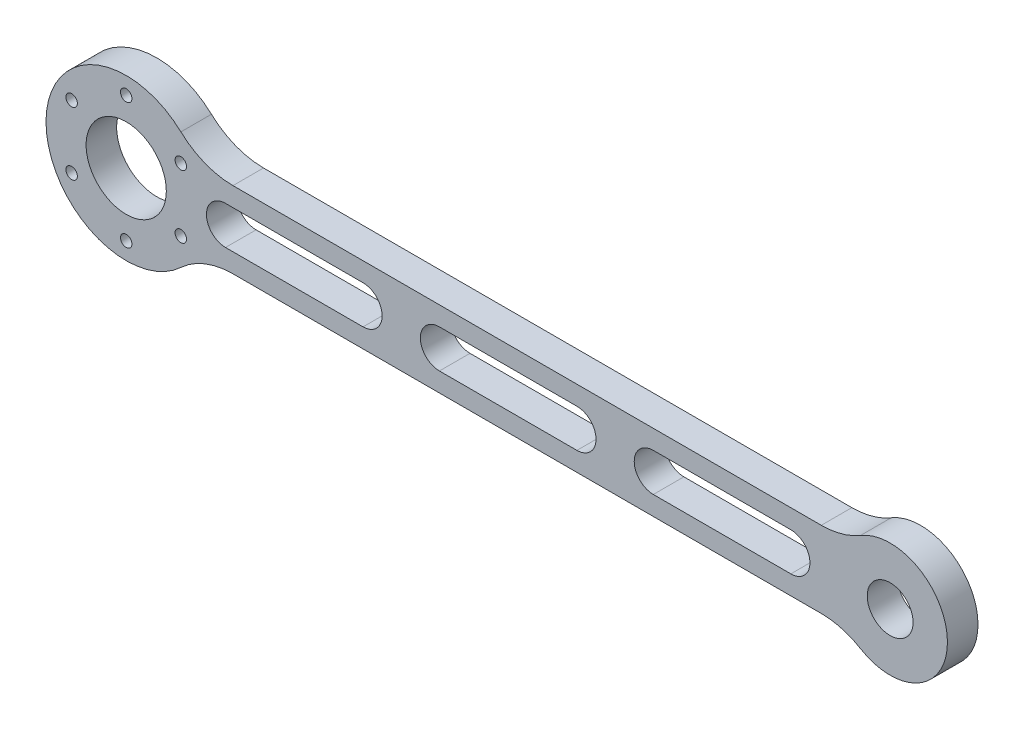
ISO-10303-21;
HEADER;
FILE_DESCRIPTION(('STEP AP214'),'2;1');
FILE_NAME('part.step','',(''),(''),'','','');
FILE_SCHEMA(('AUTOMOTIVE_DESIGN { 1 0 10303 214 1 1 1 1 }'));
ENDSEC;
DATA;
#1=APPLICATION_CONTEXT('core data for automotive mechanical design processes');
#2=APPLICATION_PROTOCOL_DEFINITION('international standard','automotive_design',2000,#1);
#3=PRODUCT_CONTEXT('',#1,'mechanical');
#4=PRODUCT('Part','Part','',(#3));
#5=PRODUCT_RELATED_PRODUCT_CATEGORY('part','',(#4));
#6=PRODUCT_DEFINITION_FORMATION('','',#4);
#7=PRODUCT_DEFINITION_CONTEXT('part definition',#1,'design');
#8=PRODUCT_DEFINITION('design','',#6,#7);
#9=PRODUCT_DEFINITION_SHAPE('','',#8);
#10=(LENGTH_UNIT() NAMED_UNIT(*) SI_UNIT(.MILLI.,.METRE.));
#11=(NAMED_UNIT(*) PLANE_ANGLE_UNIT() SI_UNIT($,.RADIAN.));
#12=(NAMED_UNIT(*) SI_UNIT($,.STERADIAN.) SOLID_ANGLE_UNIT());
#13=UNCERTAINTY_MEASURE_WITH_UNIT(LENGTH_MEASURE(1.E-05),#10,'distance_accuracy_value','');
#14=(GEOMETRIC_REPRESENTATION_CONTEXT(3) GLOBAL_UNCERTAINTY_ASSIGNED_CONTEXT((#13)) GLOBAL_UNIT_ASSIGNED_CONTEXT((#10,
#11,#12)) REPRESENTATION_CONTEXT('',''));
#15=CARTESIAN_POINT('',(0.,0.,0.));
#16=DIRECTION('',(0.,0.,1.));
#17=DIRECTION('',(1.,0.,0.));
#18=AXIS2_PLACEMENT_3D('',#15,#16,#17);
#19=CARTESIAN_POINT('',(0.,-10.,8.));
#20=DIRECTION('',(0.,1.,0.));
#21=DIRECTION('',(0.,0.,1.));
#22=AXIS2_PLACEMENT_3D('',#19,#20,#21);
#23=PLANE('',#22);
#24=DIRECTION('',(1.,0.,0.));
#25=VECTOR('',#24,1.);
#26=CARTESIAN_POINT('',(0.,-10.,8.));
#27=LINE('',#26,#25);
#28=CARTESIAN_POINT('',(27.9463772249642,-10.,8.));
#29=VERTEX_POINT('',#28);
#30=CARTESIAN_POINT('',(181.97224362268,-10.,8.));
#31=VERTEX_POINT('',#30);
#32=EDGE_CURVE('E254',#29,#31,#27,.T.);
#33=ORIENTED_EDGE('',*,*,#32,.F.);
#34=DIRECTION('',(0.,0.,-1.));
#35=VECTOR('',#34,1.);
#36=CARTESIAN_POINT('',(27.9463772249642,-10.,8.));
#37=LINE('',#36,#35);
#38=CARTESIAN_POINT('',(27.9463772249642,-10.,0.));
#39=VERTEX_POINT('',#38);
#40=EDGE_CURVE('E325',#29,#39,#37,.T.);
#41=ORIENTED_EDGE('',*,*,#40,.T.);
#42=DIRECTION('',(1.,0.,0.));
#43=VECTOR('',#42,1.);
#44=CARTESIAN_POINT('',(0.,-10.,0.));
#45=LINE('',#44,#43);
#46=CARTESIAN_POINT('',(181.97224362268,-10.,0.));
#47=VERTEX_POINT('',#46);
#48=EDGE_CURVE('E263',#39,#47,#45,.T.);
#49=ORIENTED_EDGE('',*,*,#48,.T.);
#50=DIRECTION('',(0.,0.,1.));
#51=VECTOR('',#50,1.);
#52=CARTESIAN_POINT('',(181.97224362268,-10.,8.));
#53=LINE('',#52,#51);
#54=EDGE_CURVE('E277',#47,#31,#53,.T.);
#55=ORIENTED_EDGE('',*,*,#54,.T.);
#56=EDGE_LOOP('',(#33,#41,#49,#55));
#57=FACE_BOUND('',#56,.T.);
#58=ADVANCED_FACE('F36',(#57),#23,.F.);
#59=CARTESIAN_POINT('',(200.,0.,8.));
#60=DIRECTION('',(0.,0.,-1.));
#61=DIRECTION('',(-1.,0.,0.));
#62=AXIS2_PLACEMENT_3D('',#59,#60,#61);
#63=CYLINDRICAL_SURFACE('',#62,15.);
#64=CARTESIAN_POINT('',(200.,0.,0.));
#65=DIRECTION('',(0.,0.,1.));
#66=DIRECTION('',(1.,0.,0.));
#67=AXIS2_PLACEMENT_3D('',#64,#65,#66);
#68=CIRCLE('',#67,15.);
#69=CARTESIAN_POINT('',(192.273818695434,-12.8571428571429,0.));
#70=VERTEX_POINT('',#69);
#71=CARTESIAN_POINT('',(192.273818695434,12.8571428571429,0.));
#72=VERTEX_POINT('',#71);
#73=EDGE_CURVE('E265',#70,#72,#68,.T.);
#74=ORIENTED_EDGE('',*,*,#73,.T.);
#75=DIRECTION('',(0.,0.,-1.));
#76=VECTOR('',#75,1.);
#77=CARTESIAN_POINT('',(192.273818695434,12.8571428571429,8.));
#78=LINE('',#77,#76);
#79=CARTESIAN_POINT('',(192.273818695434,12.8571428571429,8.));
#80=VERTEX_POINT('',#79);
#81=EDGE_CURVE('E275',#72,#80,#78,.F.);
#82=ORIENTED_EDGE('',*,*,#81,.T.);
#83=CARTESIAN_POINT('',(200.,0.,8.));
#84=DIRECTION('',(0.,0.,1.));
#85=DIRECTION('',(1.,0.,0.));
#86=AXIS2_PLACEMENT_3D('',#83,#84,#85);
#87=CIRCLE('',#86,15.);
#88=CARTESIAN_POINT('',(192.273818695434,-12.8571428571429,8.));
#89=VERTEX_POINT('',#88);
#90=EDGE_CURVE('E256',#89,#80,#87,.T.);
#91=ORIENTED_EDGE('',*,*,#90,.F.);
#92=DIRECTION('',(0.,0.,-1.));
#93=VECTOR('',#92,1.);
#94=CARTESIAN_POINT('',(192.273818695434,-12.8571428571429,8.));
#95=LINE('',#94,#93);
#96=EDGE_CURVE('E272',#89,#70,#95,.T.);
#97=ORIENTED_EDGE('',*,*,#96,.T.);
#98=EDGE_LOOP('',(#74,#82,#91,#97));
#99=FACE_BOUND('',#98,.T.);
#100=ADVANCED_FACE('F399',(#99),#63,.T.);
#101=CARTESIAN_POINT('',(0.,10.,8.));
#102=DIRECTION('',(0.,1.,0.));
#103=DIRECTION('',(0.,0.,1.));
#104=AXIS2_PLACEMENT_3D('',#101,#102,#103);
#105=PLANE('',#104);
#106=DIRECTION('',(1.,0.,0.));
#107=VECTOR('',#106,1.);
#108=CARTESIAN_POINT('',(0.,10.,0.));
#109=LINE('',#108,#107);
#110=CARTESIAN_POINT('',(27.9463772249642,10.,0.));
#111=VERTEX_POINT('',#110);
#112=CARTESIAN_POINT('',(181.97224362268,10.,0.));
#113=VERTEX_POINT('',#112);
#114=EDGE_CURVE('E257',#111,#113,#109,.T.);
#115=ORIENTED_EDGE('',*,*,#114,.F.);
#116=DIRECTION('',(0.,0.,1.));
#117=VECTOR('',#116,1.);
#118=CARTESIAN_POINT('',(27.9463772249642,10.,8.));
#119=LINE('',#118,#117);
#120=CARTESIAN_POINT('',(27.9463772249642,10.,8.));
#121=VERTEX_POINT('',#120);
#122=EDGE_CURVE('E57',#111,#121,#119,.T.);
#123=ORIENTED_EDGE('',*,*,#122,.T.);
#124=DIRECTION('',(1.,0.,0.));
#125=VECTOR('',#124,1.);
#126=CARTESIAN_POINT('',(0.,10.,8.));
#127=LINE('',#126,#125);
#128=CARTESIAN_POINT('',(181.97224362268,10.,8.));
#129=VERTEX_POINT('',#128);
#130=EDGE_CURVE('E260',#121,#129,#127,.T.);
#131=ORIENTED_EDGE('',*,*,#130,.T.);
#132=DIRECTION('',(0.,0.,-1.));
#133=VECTOR('',#132,1.);
#134=CARTESIAN_POINT('',(181.97224362268,10.,8.));
#135=LINE('',#134,#133);
#136=EDGE_CURVE('E262',#129,#113,#135,.T.);
#137=ORIENTED_EDGE('',*,*,#136,.T.);
#138=EDGE_LOOP('',(#115,#123,#131,#137));
#139=FACE_BOUND('',#138,.T.);
#140=ADVANCED_FACE('F404',(#139),#105,.T.);
#141=CARTESIAN_POINT('',(0.,0.,8.));
#142=DIRECTION('',(0.,0.,1.));
#143=DIRECTION('',(1.,0.,0.));
#144=AXIS2_PLACEMENT_3D('',#141,#142,#143);
#145=PLANE('',#144);
#146=CARTESIAN_POINT('',(0.,16.5,8.));
#147=DIRECTION('',(0.,0.,-1.));
#148=DIRECTION('',(-1.,0.,0.));
#149=AXIS2_PLACEMENT_3D('',#146,#147,#148);
#150=CIRCLE('',#149,1.5);
#151=CARTESIAN_POINT('',(-1.5,16.5,8.));
#152=VERTEX_POINT('',#151);
#153=EDGE_CURVE('E357',#152,#152,#150,.T.);
#154=ORIENTED_EDGE('',*,*,#153,.T.);
#155=EDGE_LOOP('',(#154));
#156=FACE_BOUND('',#155,.T.);
#157=CARTESIAN_POINT('',(14.2894191624429,8.24999999999938,8.));
#158=DIRECTION('',(0.,0.,-1.));
#159=DIRECTION('',(-1.,0.,0.));
#160=AXIS2_PLACEMENT_3D('',#157,#158,#159);
#161=CIRCLE('',#160,1.50000000000071);
#162=CARTESIAN_POINT('',(12.7894191624422,8.24999999999938,8.));
#163=VERTEX_POINT('',#162);
#164=EDGE_CURVE('E489',#163,#163,#161,.T.);
#165=ORIENTED_EDGE('',*,*,#164,.T.);
#166=EDGE_LOOP('',(#165));
#167=FACE_BOUND('',#166,.T.);
#168=CARTESIAN_POINT('',(14.2894191624422,-8.25000000000061,8.));
#169=DIRECTION('',(0.,0.,-1.));
#170=DIRECTION('',(-1.,0.,0.));
#171=AXIS2_PLACEMENT_3D('',#168,#169,#170);
#172=CIRCLE('',#171,1.50000000000134);
#173=CARTESIAN_POINT('',(12.7894191624408,-8.25000000000061,8.));
#174=VERTEX_POINT('',#173);
#175=EDGE_CURVE('E493',#174,#174,#172,.T.);
#176=ORIENTED_EDGE('',*,*,#175,.T.);
#177=EDGE_LOOP('',(#176));
#178=FACE_BOUND('',#177,.T.);
#179=CARTESIAN_POINT('',(-1.40283328236781E-12,-16.5,8.));
#180=DIRECTION('',(0.,0.,-1.));
#181=DIRECTION('',(-1.,0.,0.));
#182=AXIS2_PLACEMENT_3D('',#179,#180,#181);
#183=CIRCLE('',#182,1.50000000000145);
#184=CARTESIAN_POINT('',(-1.50000000000286,-16.5,8.));
#185=VERTEX_POINT('',#184);
#186=EDGE_CURVE('E497',#185,#185,#183,.T.);
#187=ORIENTED_EDGE('',*,*,#186,.T.);
#188=EDGE_LOOP('',(#187));
#189=FACE_BOUND('',#188,.T.);
#190=CARTESIAN_POINT('',(-14.2894191624443,-8.24999999999939,8.));
#191=DIRECTION('',(0.,0.,-1.));
#192=DIRECTION('',(-1.,0.,0.));
#193=AXIS2_PLACEMENT_3D('',#190,#191,#192);
#194=CIRCLE('',#193,1.50000000000091);
#195=CARTESIAN_POINT('',(-15.7894191624452,-8.24999999999939,8.));
#196=VERTEX_POINT('',#195);
#197=EDGE_CURVE('E501',#196,#196,#194,.T.);
#198=ORIENTED_EDGE('',*,*,#197,.T.);
#199=EDGE_LOOP('',(#198));
#200=FACE_BOUND('',#199,.T.);
#201=CARTESIAN_POINT('',(-14.2894191624436,8.25000000000061,8.));
#202=DIRECTION('',(0.,0.,-1.));
#203=DIRECTION('',(-1.,0.,0.));
#204=AXIS2_PLACEMENT_3D('',#201,#202,#203);
#205=CIRCLE('',#204,1.5000000000002);
#206=CARTESIAN_POINT('',(-15.7894191624438,8.25000000000061,8.));
#207=VERTEX_POINT('',#206);
#208=EDGE_CURVE('E504',#207,#207,#205,.T.);
#209=ORIENTED_EDGE('',*,*,#208,.T.);
#210=EDGE_LOOP('',(#209));
#211=FACE_BOUND('',#210,.T.);
#212=CARTESIAN_POINT('',(0.,0.,8.));
#213=DIRECTION('',(0.,0.,-1.));
#214=DIRECTION('',(-1.,0.,0.));
#215=AXIS2_PLACEMENT_3D('',#212,#213,#214);
#216=CIRCLE('',#215,21.);
#217=CARTESIAN_POINT('',(14.3139980908353,-15.3658536585366,8.));
#218=VERTEX_POINT('',#217);
#219=CARTESIAN_POINT('',(14.3139980908353,15.3658536585366,8.));
#220=VERTEX_POINT('',#219);
#221=EDGE_CURVE('E231',#218,#220,#216,.T.);
#222=ORIENTED_EDGE('',*,*,#221,.F.);
#223=CARTESIAN_POINT('',(27.9463772249642,-30.,8.));
#224=DIRECTION('',(0.,0.,1.));
#225=DIRECTION('',(1.,0.,0.));
#226=AXIS2_PLACEMENT_3D('',#223,#224,#225);
#227=CIRCLE('',#226,20.);
#228=EDGE_CURVE('E336',#218,#29,#227,.F.);
#229=ORIENTED_EDGE('',*,*,#228,.T.);
#230=ORIENTED_EDGE('',*,*,#32,.T.);
#231=CARTESIAN_POINT('',(181.97224362268,-30.,8.));
#232=DIRECTION('',(0.,0.,1.));
#233=DIRECTION('',(1.,0.,0.));
#234=AXIS2_PLACEMENT_3D('',#231,#232,#233);
#235=CIRCLE('',#234,20.);
#236=EDGE_CURVE('E288',#31,#89,#235,.F.);
#237=ORIENTED_EDGE('',*,*,#236,.T.);
#238=ORIENTED_EDGE('',*,*,#90,.T.);
#239=CARTESIAN_POINT('',(181.97224362268,30.,8.));
#240=DIRECTION('',(0.,0.,1.));
#241=DIRECTION('',(1.,0.,0.));
#242=AXIS2_PLACEMENT_3D('',#239,#240,#241);
#243=CIRCLE('',#242,20.);
#244=EDGE_CURVE('E282',#80,#129,#243,.F.);
#245=ORIENTED_EDGE('',*,*,#244,.T.);
#246=ORIENTED_EDGE('',*,*,#130,.F.);
#247=CARTESIAN_POINT('',(27.9463772249642,30.,8.));
#248=DIRECTION('',(0.,0.,1.));
#249=DIRECTION('',(1.,0.,0.));
#250=AXIS2_PLACEMENT_3D('',#247,#248,#249);
#251=CIRCLE('',#250,20.);
#252=EDGE_CURVE('E11',#121,#220,#251,.F.);
#253=ORIENTED_EDGE('',*,*,#252,.T.);
#254=EDGE_LOOP('',(#222,#229,#230,#237,#238,#245,#246,#253));
#255=FACE_BOUND('',#254,.T.);
#256=CARTESIAN_POINT('',(138.,0.,8.));
#257=DIRECTION('',(0.,0.,1.));
#258=DIRECTION('',(1.,0.,0.));
#259=AXIS2_PLACEMENT_3D('',#256,#257,#258);
#260=CIRCLE('',#259,4.99999999999999);
#261=CARTESIAN_POINT('',(138.,5.,8.));
#262=VERTEX_POINT('',#261);
#263=CARTESIAN_POINT('',(138.,-5.00000000000002,8.));
#264=VERTEX_POINT('',#263);
#265=EDGE_CURVE('E192',#262,#264,#260,.T.);
#266=ORIENTED_EDGE('',*,*,#265,.F.);
#267=DIRECTION('',(-1.,0.,0.));
#268=VECTOR('',#267,1.);
#269=CARTESIAN_POINT('',(0.,5.00000000000004,8.));
#270=LINE('',#269,#268);
#271=CARTESIAN_POINT('',(174.,4.99999999999999,8.));
#272=VERTEX_POINT('',#271);
#273=EDGE_CURVE('E197',#272,#262,#270,.T.);
#274=ORIENTED_EDGE('',*,*,#273,.F.);
#275=CARTESIAN_POINT('',(174.,0.,8.));
#276=DIRECTION('',(0.,0.,1.));
#277=DIRECTION('',(1.,0.,0.));
#278=AXIS2_PLACEMENT_3D('',#275,#276,#277);
#279=CIRCLE('',#278,4.99999999999999);
#280=CARTESIAN_POINT('',(174.,-5.,8.));
#281=VERTEX_POINT('',#280);
#282=EDGE_CURVE('E176',#281,#272,#279,.T.);
#283=ORIENTED_EDGE('',*,*,#282,.F.);
#284=DIRECTION('',(-1.,0.,0.));
#285=VECTOR('',#284,1.);
#286=CARTESIAN_POINT('',(0.,-5.00000000000007,8.));
#287=LINE('',#286,#285);
#288=EDGE_CURVE('E187',#281,#264,#287,.T.);
#289=ORIENTED_EDGE('',*,*,#288,.T.);
#290=EDGE_LOOP('',(#266,#274,#283,#289));
#291=FACE_BOUND('',#290,.T.);
#292=CARTESIAN_POINT('',(118.,0.,8.));
#293=DIRECTION('',(0.,0.,1.));
#294=DIRECTION('',(1.,0.,0.));
#295=AXIS2_PLACEMENT_3D('',#292,#293,#294);
#296=CIRCLE('',#295,5.);
#297=CARTESIAN_POINT('',(118.,-5.,8.));
#298=VERTEX_POINT('',#297);
#299=CARTESIAN_POINT('',(118.,4.99999999999999,8.));
#300=VERTEX_POINT('',#299);
#301=EDGE_CURVE('E207',#298,#300,#296,.T.);
#302=ORIENTED_EDGE('',*,*,#301,.F.);
#303=DIRECTION('',(-1.,0.,0.));
#304=VECTOR('',#303,1.);
#305=CARTESIAN_POINT('',(0.,-5.00000000000005,8.));
#306=LINE('',#305,#304);
#307=CARTESIAN_POINT('',(82.,-5.00000000000002,8.));
#308=VERTEX_POINT('',#307);
#309=EDGE_CURVE('E216',#298,#308,#306,.T.);
#310=ORIENTED_EDGE('',*,*,#309,.T.);
#311=CARTESIAN_POINT('',(82.,0.,8.));
#312=DIRECTION('',(0.,0.,1.));
#313=DIRECTION('',(1.,0.,0.));
#314=AXIS2_PLACEMENT_3D('',#311,#312,#313);
#315=CIRCLE('',#314,5.);
#316=CARTESIAN_POINT('',(82.,5.,8.));
#317=VERTEX_POINT('',#316);
#318=EDGE_CURVE('E213',#317,#308,#315,.T.);
#319=ORIENTED_EDGE('',*,*,#318,.F.);
#320=DIRECTION('',(-1.,0.,0.));
#321=VECTOR('',#320,1.);
#322=CARTESIAN_POINT('',(0.,5.00000000000002,8.));
#323=LINE('',#322,#321);
#324=EDGE_CURVE('E209',#300,#317,#323,.T.);
#325=ORIENTED_EDGE('',*,*,#324,.F.);
#326=EDGE_LOOP('',(#302,#310,#319,#325));
#327=FACE_BOUND('',#326,.T.);
#328=CARTESIAN_POINT('',(62.,-3.97984803854338E-13,8.));
#329=DIRECTION('',(0.,0.,1.));
#330=DIRECTION('',(1.,0.,0.));
#331=AXIS2_PLACEMENT_3D('',#328,#329,#330);
#332=CIRCLE('',#331,5.00000000000001);
#333=CARTESIAN_POINT('',(62.,-5.0000000000004,8.));
#334=VERTEX_POINT('',#333);
#335=CARTESIAN_POINT('',(62.,4.9999999999996,8.));
#336=VERTEX_POINT('',#335);
#337=EDGE_CURVE('E228',#334,#336,#332,.T.);
#338=ORIENTED_EDGE('',*,*,#337,.F.);
#339=DIRECTION('',(-1.,0.,0.));
#340=VECTOR('',#339,1.);
#341=CARTESIAN_POINT('',(0.,-5.00000000000042,8.));
#342=LINE('',#341,#340);
#343=CARTESIAN_POINT('',(26.,-5.00000000000041,8.));
#344=VERTEX_POINT('',#343);
#345=EDGE_CURVE('E237',#334,#344,#342,.T.);
#346=ORIENTED_EDGE('',*,*,#345,.T.);
#347=CARTESIAN_POINT('',(26.,-4.01454250806292E-13,8.));
#348=DIRECTION('',(0.,0.,1.));
#349=DIRECTION('',(1.,0.,0.));
#350=AXIS2_PLACEMENT_3D('',#347,#348,#349);
#351=CIRCLE('',#350,5.);
#352=CARTESIAN_POINT('',(26.,4.99999999999961,8.));
#353=VERTEX_POINT('',#352);
#354=EDGE_CURVE('E234',#353,#344,#351,.T.);
#355=ORIENTED_EDGE('',*,*,#354,.F.);
#356=DIRECTION('',(-1.,0.,0.));
#357=VECTOR('',#356,1.);
#358=CARTESIAN_POINT('',(0.,4.99999999999962,8.));
#359=LINE('',#358,#357);
#360=EDGE_CURVE('E230',#336,#353,#359,.T.);
#361=ORIENTED_EDGE('',*,*,#360,.F.);
#362=EDGE_LOOP('',(#338,#346,#355,#361));
#363=FACE_BOUND('',#362,.T.);
#364=CARTESIAN_POINT('',(200.,0.,8.));
#365=DIRECTION('',(0.,0.,1.));
#366=DIRECTION('',(1.,0.,0.));
#367=AXIS2_PLACEMENT_3D('',#364,#365,#366);
#368=CIRCLE('',#367,6.00000000000002);
#369=CARTESIAN_POINT('',(206.,0.,8.));
#370=VERTEX_POINT('',#369);
#371=EDGE_CURVE('E204',#370,#370,#368,.T.);
#372=ORIENTED_EDGE('',*,*,#371,.F.);
#373=EDGE_LOOP('',(#372));
#374=FACE_BOUND('',#373,.T.);
#375=CARTESIAN_POINT('',(0.,0.,8.));
#376=DIRECTION('',(0.,0.,1.));
#377=DIRECTION('',(1.,0.,0.));
#378=AXIS2_PLACEMENT_3D('',#375,#376,#377);
#379=CIRCLE('',#378,10.5);
#380=CARTESIAN_POINT('',(10.5,0.,8.));
#381=VERTEX_POINT('',#380);
#382=EDGE_CURVE('E248',#381,#381,#379,.T.);
#383=ORIENTED_EDGE('',*,*,#382,.F.);
#384=EDGE_LOOP('',(#383));
#385=FACE_BOUND('',#384,.T.);
#386=ADVANCED_FACE('F194',(#156,#167,#178,#189,#200,#211,#255,#291,#327,#363,#374,#385),#145,.T.);
#387=CARTESIAN_POINT('',(0.,0.,0.));
#388=DIRECTION('',(0.,0.,1.));
#389=DIRECTION('',(1.,0.,0.));
#390=AXIS2_PLACEMENT_3D('',#387,#388,#389);
#391=PLANE('',#390);
#392=CARTESIAN_POINT('',(0.,16.5,0.));
#393=DIRECTION('',(0.,0.,-1.));
#394=DIRECTION('',(-1.,0.,0.));
#395=AXIS2_PLACEMENT_3D('',#392,#393,#394);
#396=CIRCLE('',#395,1.5);
#397=CARTESIAN_POINT('',(-1.5,16.5,0.));
#398=VERTEX_POINT('',#397);
#399=EDGE_CURVE('E361',#398,#398,#396,.T.);
#400=ORIENTED_EDGE('',*,*,#399,.F.);
#401=EDGE_LOOP('',(#400));
#402=FACE_BOUND('',#401,.T.);
#403=CARTESIAN_POINT('',(14.2894191624429,8.24999999999938,0.));
#404=DIRECTION('',(0.,0.,-1.));
#405=DIRECTION('',(-1.,0.,0.));
#406=AXIS2_PLACEMENT_3D('',#403,#404,#405);
#407=CIRCLE('',#406,1.50000000000071);
#408=CARTESIAN_POINT('',(12.7894191624422,8.24999999999938,0.));
#409=VERTEX_POINT('',#408);
#410=EDGE_CURVE('E513',#409,#409,#407,.T.);
#411=ORIENTED_EDGE('',*,*,#410,.F.);
#412=EDGE_LOOP('',(#411));
#413=FACE_BOUND('',#412,.T.);
#414=CARTESIAN_POINT('',(14.2894191624422,-8.25000000000061,0.));
#415=DIRECTION('',(0.,0.,-1.));
#416=DIRECTION('',(-1.,0.,0.));
#417=AXIS2_PLACEMENT_3D('',#414,#415,#416);
#418=CIRCLE('',#417,1.50000000000134);
#419=CARTESIAN_POINT('',(12.7894191624408,-8.25000000000061,0.));
#420=VERTEX_POINT('',#419);
#421=EDGE_CURVE('E524',#420,#420,#418,.T.);
#422=ORIENTED_EDGE('',*,*,#421,.F.);
#423=EDGE_LOOP('',(#422));
#424=FACE_BOUND('',#423,.T.);
#425=CARTESIAN_POINT('',(-1.40283328236781E-12,-16.5,0.));
#426=DIRECTION('',(0.,0.,-1.));
#427=DIRECTION('',(-1.,0.,0.));
#428=AXIS2_PLACEMENT_3D('',#425,#426,#427);
#429=CIRCLE('',#428,1.50000000000145);
#430=CARTESIAN_POINT('',(-1.50000000000286,-16.5,0.));
#431=VERTEX_POINT('',#430);
#432=EDGE_CURVE('E521',#431,#431,#429,.T.);
#433=ORIENTED_EDGE('',*,*,#432,.F.);
#434=EDGE_LOOP('',(#433));
#435=FACE_BOUND('',#434,.T.);
#436=CARTESIAN_POINT('',(-14.2894191624443,-8.24999999999939,0.));
#437=DIRECTION('',(0.,0.,-1.));
#438=DIRECTION('',(-1.,0.,0.));
#439=AXIS2_PLACEMENT_3D('',#436,#437,#438);
#440=CIRCLE('',#439,1.50000000000091);
#441=CARTESIAN_POINT('',(-15.7894191624452,-8.24999999999939,0.));
#442=VERTEX_POINT('',#441);
#443=EDGE_CURVE('E517',#442,#442,#440,.T.);
#444=ORIENTED_EDGE('',*,*,#443,.F.);
#445=EDGE_LOOP('',(#444));
#446=FACE_BOUND('',#445,.T.);
#447=CARTESIAN_POINT('',(-14.2894191624436,8.25000000000061,0.));
#448=DIRECTION('',(0.,0.,-1.));
#449=DIRECTION('',(-1.,0.,0.));
#450=AXIS2_PLACEMENT_3D('',#447,#448,#449);
#451=CIRCLE('',#450,1.5000000000002);
#452=CARTESIAN_POINT('',(-15.7894191624438,8.25000000000061,0.));
#453=VERTEX_POINT('',#452);
#454=EDGE_CURVE('E506',#453,#453,#451,.T.);
#455=ORIENTED_EDGE('',*,*,#454,.F.);
#456=EDGE_LOOP('',(#455));
#457=FACE_BOUND('',#456,.T.);
#458=ORIENTED_EDGE('',*,*,#48,.F.);
#459=CARTESIAN_POINT('',(27.9463772249642,-30.,0.));
#460=DIRECTION('',(0.,0.,1.));
#461=DIRECTION('',(1.,0.,0.));
#462=AXIS2_PLACEMENT_3D('',#459,#460,#461);
#463=CIRCLE('',#462,20.);
#464=CARTESIAN_POINT('',(14.3139980908353,-15.3658536585366,0.));
#465=VERTEX_POINT('',#464);
#466=EDGE_CURVE('E334',#39,#465,#463,.T.);
#467=ORIENTED_EDGE('',*,*,#466,.T.);
#468=CARTESIAN_POINT('',(0.,0.,0.));
#469=DIRECTION('',(0.,0.,-1.));
#470=DIRECTION('',(-1.,0.,0.));
#471=AXIS2_PLACEMENT_3D('',#468,#469,#470);
#472=CIRCLE('',#471,21.);
#473=CARTESIAN_POINT('',(14.3139980908353,15.3658536585366,0.));
#474=VERTEX_POINT('',#473);
#475=EDGE_CURVE('E353',#465,#474,#472,.T.);
#476=ORIENTED_EDGE('',*,*,#475,.T.);
#477=CARTESIAN_POINT('',(27.9463772249642,30.,0.));
#478=DIRECTION('',(0.,0.,1.));
#479=DIRECTION('',(1.,0.,0.));
#480=AXIS2_PLACEMENT_3D('',#477,#478,#479);
#481=CIRCLE('',#480,20.);
#482=EDGE_CURVE('E44',#474,#111,#481,.T.);
#483=ORIENTED_EDGE('',*,*,#482,.T.);
#484=ORIENTED_EDGE('',*,*,#114,.T.);
#485=CARTESIAN_POINT('',(181.97224362268,30.,0.));
#486=DIRECTION('',(0.,0.,1.));
#487=DIRECTION('',(1.,0.,0.));
#488=AXIS2_PLACEMENT_3D('',#485,#486,#487);
#489=CIRCLE('',#488,20.);
#490=EDGE_CURVE('E280',#113,#72,#489,.T.);
#491=ORIENTED_EDGE('',*,*,#490,.T.);
#492=ORIENTED_EDGE('',*,*,#73,.F.);
#493=CARTESIAN_POINT('',(181.97224362268,-30.,0.));
#494=DIRECTION('',(0.,0.,1.));
#495=DIRECTION('',(1.,0.,0.));
#496=AXIS2_PLACEMENT_3D('',#493,#494,#495);
#497=CIRCLE('',#496,20.);
#498=EDGE_CURVE('E285',#70,#47,#497,.T.);
#499=ORIENTED_EDGE('',*,*,#498,.T.);
#500=EDGE_LOOP('',(#458,#467,#476,#483,#484,#491,#492,#499));
#501=FACE_BOUND('',#500,.T.);
#502=DIRECTION('',(-1.,0.,0.));
#503=VECTOR('',#502,1.);
#504=CARTESIAN_POINT('',(0.,5.00000000000004,0.));
#505=LINE('',#504,#503);
#506=CARTESIAN_POINT('',(174.,4.99999999999999,0.));
#507=VERTEX_POINT('',#506);
#508=CARTESIAN_POINT('',(138.,5.,0.));
#509=VERTEX_POINT('',#508);
#510=EDGE_CURVE('E319',#507,#509,#505,.T.);
#511=ORIENTED_EDGE('',*,*,#510,.T.);
#512=CARTESIAN_POINT('',(138.,0.,0.));
#513=DIRECTION('',(0.,0.,1.));
#514=DIRECTION('',(1.,0.,0.));
#515=AXIS2_PLACEMENT_3D('',#512,#513,#514);
#516=CIRCLE('',#515,4.99999999999999);
#517=CARTESIAN_POINT('',(138.,-5.00000000000002,0.));
#518=VERTEX_POINT('',#517);
#519=EDGE_CURVE('E322',#509,#518,#516,.T.);
#520=ORIENTED_EDGE('',*,*,#519,.T.);
#521=DIRECTION('',(-1.,0.,0.));
#522=VECTOR('',#521,1.);
#523=CARTESIAN_POINT('',(0.,-5.00000000000007,0.));
#524=LINE('',#523,#522);
#525=CARTESIAN_POINT('',(174.,-5.,0.));
#526=VERTEX_POINT('',#525);
#527=EDGE_CURVE('E316',#526,#518,#524,.T.);
#528=ORIENTED_EDGE('',*,*,#527,.F.);
#529=CARTESIAN_POINT('',(174.,0.,0.));
#530=DIRECTION('',(0.,0.,1.));
#531=DIRECTION('',(1.,0.,0.));
#532=AXIS2_PLACEMENT_3D('',#529,#530,#531);
#533=CIRCLE('',#532,4.99999999999999);
#534=EDGE_CURVE('E179',#526,#507,#533,.T.);
#535=ORIENTED_EDGE('',*,*,#534,.T.);
#536=EDGE_LOOP('',(#511,#520,#528,#535));
#537=FACE_BOUND('',#536,.T.);
#538=DIRECTION('',(-1.,0.,0.));
#539=VECTOR('',#538,1.);
#540=CARTESIAN_POINT('',(0.,-5.00000000000005,0.));
#541=LINE('',#540,#539);
#542=CARTESIAN_POINT('',(118.,-5.,0.));
#543=VERTEX_POINT('',#542);
#544=CARTESIAN_POINT('',(82.,-5.00000000000002,0.));
#545=VERTEX_POINT('',#544);
#546=EDGE_CURVE('E311',#543,#545,#541,.T.);
#547=ORIENTED_EDGE('',*,*,#546,.F.);
#548=CARTESIAN_POINT('',(118.,0.,0.));
#549=DIRECTION('',(0.,0.,1.));
#550=DIRECTION('',(1.,0.,0.));
#551=AXIS2_PLACEMENT_3D('',#548,#549,#550);
#552=CIRCLE('',#551,5.);
#553=CARTESIAN_POINT('',(118.,4.99999999999999,0.));
#554=VERTEX_POINT('',#553);
#555=EDGE_CURVE('E313',#543,#554,#552,.T.);
#556=ORIENTED_EDGE('',*,*,#555,.T.);
#557=DIRECTION('',(-1.,0.,0.));
#558=VECTOR('',#557,1.);
#559=CARTESIAN_POINT('',(0.,5.00000000000002,0.));
#560=LINE('',#559,#558);
#561=CARTESIAN_POINT('',(82.,5.,0.));
#562=VERTEX_POINT('',#561);
#563=EDGE_CURVE('E305',#554,#562,#560,.T.);
#564=ORIENTED_EDGE('',*,*,#563,.T.);
#565=CARTESIAN_POINT('',(82.,0.,0.));
#566=DIRECTION('',(0.,0.,1.));
#567=DIRECTION('',(1.,0.,0.));
#568=AXIS2_PLACEMENT_3D('',#565,#566,#567);
#569=CIRCLE('',#568,5.);
#570=EDGE_CURVE('E308',#562,#545,#569,.T.);
#571=ORIENTED_EDGE('',*,*,#570,.T.);
#572=EDGE_LOOP('',(#547,#556,#564,#571));
#573=FACE_BOUND('',#572,.T.);
#574=DIRECTION('',(-1.,0.,0.));
#575=VECTOR('',#574,1.);
#576=CARTESIAN_POINT('',(0.,-5.00000000000042,0.));
#577=LINE('',#576,#575);
#578=CARTESIAN_POINT('',(62.,-5.0000000000004,0.));
#579=VERTEX_POINT('',#578);
#580=CARTESIAN_POINT('',(26.,-5.00000000000041,0.));
#581=VERTEX_POINT('',#580);
#582=EDGE_CURVE('E300',#579,#581,#577,.T.);
#583=ORIENTED_EDGE('',*,*,#582,.F.);
#584=CARTESIAN_POINT('',(62.,-3.97984803854338E-13,0.));
#585=DIRECTION('',(0.,0.,1.));
#586=DIRECTION('',(1.,0.,0.));
#587=AXIS2_PLACEMENT_3D('',#584,#585,#586);
#588=CIRCLE('',#587,5.00000000000001);
#589=CARTESIAN_POINT('',(62.,4.9999999999996,0.));
#590=VERTEX_POINT('',#589);
#591=EDGE_CURVE('E302',#579,#590,#588,.T.);
#592=ORIENTED_EDGE('',*,*,#591,.T.);
#593=DIRECTION('',(-1.,0.,0.));
#594=VECTOR('',#593,1.);
#595=CARTESIAN_POINT('',(0.,4.99999999999962,0.));
#596=LINE('',#595,#594);
#597=CARTESIAN_POINT('',(26.,4.99999999999961,0.));
#598=VERTEX_POINT('',#597);
#599=EDGE_CURVE('E290',#590,#598,#596,.T.);
#600=ORIENTED_EDGE('',*,*,#599,.T.);
#601=CARTESIAN_POINT('',(26.,-4.01454250806292E-13,0.));
#602=DIRECTION('',(0.,0.,1.));
#603=DIRECTION('',(1.,0.,0.));
#604=AXIS2_PLACEMENT_3D('',#601,#602,#603);
#605=CIRCLE('',#604,5.);
#606=EDGE_CURVE('E297',#598,#581,#605,.T.);
#607=ORIENTED_EDGE('',*,*,#606,.T.);
#608=EDGE_LOOP('',(#583,#592,#600,#607));
#609=FACE_BOUND('',#608,.T.);
#610=CARTESIAN_POINT('',(200.,0.,0.));
#611=DIRECTION('',(0.,0.,1.));
#612=DIRECTION('',(1.,0.,0.));
#613=AXIS2_PLACEMENT_3D('',#610,#611,#612);
#614=CIRCLE('',#613,6.00000000000002);
#615=CARTESIAN_POINT('',(206.,0.,0.));
#616=VERTEX_POINT('',#615);
#617=EDGE_CURVE('E251',#616,#616,#614,.T.);
#618=ORIENTED_EDGE('',*,*,#617,.T.);
#619=EDGE_LOOP('',(#618));
#620=FACE_BOUND('',#619,.T.);
#621=CARTESIAN_POINT('',(0.,0.,0.));
#622=DIRECTION('',(0.,0.,1.));
#623=DIRECTION('',(1.,0.,0.));
#624=AXIS2_PLACEMENT_3D('',#621,#622,#623);
#625=CIRCLE('',#624,10.5);
#626=CARTESIAN_POINT('',(10.5,0.,0.));
#627=VERTEX_POINT('',#626);
#628=EDGE_CURVE('E266',#627,#627,#625,.T.);
#629=ORIENTED_EDGE('',*,*,#628,.T.);
#630=EDGE_LOOP('',(#629));
#631=FACE_BOUND('',#630,.T.);
#632=ADVANCED_FACE('F351',(#402,#413,#424,#435,#446,#457,#501,#537,#573,#609,#620,#631),#391,.F.);
#633=CARTESIAN_POINT('',(181.97224362268,30.,8.));
#634=DIRECTION('',(0.,0.,-1.));
#635=DIRECTION('',(-1.,0.,0.));
#636=AXIS2_PLACEMENT_3D('',#633,#634,#635);
#637=CYLINDRICAL_SURFACE('',#636,20.);
#638=ORIENTED_EDGE('',*,*,#244,.F.);
#639=ORIENTED_EDGE('',*,*,#81,.F.);
#640=ORIENTED_EDGE('',*,*,#490,.F.);
#641=ORIENTED_EDGE('',*,*,#136,.F.);
#642=EDGE_LOOP('',(#638,#639,#640,#641));
#643=FACE_BOUND('',#642,.T.);
#644=ADVANCED_FACE('F371',(#643),#637,.F.);
#645=CARTESIAN_POINT('',(181.97224362268,-30.,8.));
#646=DIRECTION('',(0.,0.,-1.));
#647=DIRECTION('',(-1.,0.,0.));
#648=AXIS2_PLACEMENT_3D('',#645,#646,#647);
#649=CYLINDRICAL_SURFACE('',#648,20.);
#650=ORIENTED_EDGE('',*,*,#236,.F.);
#651=ORIENTED_EDGE('',*,*,#54,.F.);
#652=ORIENTED_EDGE('',*,*,#498,.F.);
#653=ORIENTED_EDGE('',*,*,#96,.F.);
#654=EDGE_LOOP('',(#650,#651,#652,#653));
#655=FACE_BOUND('',#654,.T.);
#656=ADVANCED_FACE('F395',(#655),#649,.F.);
#657=CARTESIAN_POINT('',(200.,0.,-2.));
#658=DIRECTION('',(0.,0.,1.));
#659=DIRECTION('',(1.,0.,0.));
#660=AXIS2_PLACEMENT_3D('',#657,#658,#659);
#661=CYLINDRICAL_SURFACE('',#660,6.00000000000002);
#662=ORIENTED_EDGE('',*,*,#371,.T.);
#663=EDGE_LOOP('',(#662));
#664=FACE_BOUND('',#663,.T.);
#665=ORIENTED_EDGE('',*,*,#617,.F.);
#666=EDGE_LOOP('',(#665));
#667=FACE_BOUND('',#666,.T.);
#668=ADVANCED_FACE('F385',(#664,#667),#661,.F.);
#669=CARTESIAN_POINT('',(0.,0.,-2.));
#670=DIRECTION('',(0.,0.,1.));
#671=DIRECTION('',(1.,0.,0.));
#672=AXIS2_PLACEMENT_3D('',#669,#670,#671);
#673=CYLINDRICAL_SURFACE('',#672,10.5);
#674=ORIENTED_EDGE('',*,*,#382,.T.);
#675=EDGE_LOOP('',(#674));
#676=FACE_BOUND('',#675,.T.);
#677=ORIENTED_EDGE('',*,*,#628,.F.);
#678=EDGE_LOOP('',(#677));
#679=FACE_BOUND('',#678,.T.);
#680=ADVANCED_FACE('F382',(#676,#679),#673,.F.);
#681=CARTESIAN_POINT('',(62.,-3.97984803854338E-13,-2.));
#682=DIRECTION('',(0.,0.,1.));
#683=DIRECTION('',(1.,0.,0.));
#684=AXIS2_PLACEMENT_3D('',#681,#682,#683);
#685=CYLINDRICAL_SURFACE('',#684,5.00000000000001);
#686=DIRECTION('',(0.,0.,1.));
#687=VECTOR('',#686,1.);
#688=CARTESIAN_POINT('',(62.,-5.0000000000004,-2.));
#689=LINE('',#688,#687);
#690=EDGE_CURVE('E210',#579,#334,#689,.T.);
#691=ORIENTED_EDGE('',*,*,#690,.T.);
#692=ORIENTED_EDGE('',*,*,#337,.T.);
#693=DIRECTION('',(0.,0.,1.));
#694=VECTOR('',#693,1.);
#695=CARTESIAN_POINT('',(62.,4.9999999999996,-2.));
#696=LINE('',#695,#694);
#697=EDGE_CURVE('E240',#590,#336,#696,.T.);
#698=ORIENTED_EDGE('',*,*,#697,.F.);
#699=ORIENTED_EDGE('',*,*,#591,.F.);
#700=EDGE_LOOP('',(#691,#692,#698,#699));
#701=FACE_BOUND('',#700,.T.);
#702=ADVANCED_FACE('F384',(#701),#685,.F.);
#703=CARTESIAN_POINT('',(0.,-5.00000000000042,-2.));
#704=DIRECTION('',(0.,1.,0.));
#705=DIRECTION('',(-1.,0.,0.));
#706=AXIS2_PLACEMENT_3D('',#703,#704,#705);
#707=PLANE('',#706);
#708=ORIENTED_EDGE('',*,*,#582,.T.);
#709=DIRECTION('',(0.,0.,1.));
#710=VECTOR('',#709,1.);
#711=CARTESIAN_POINT('',(26.,-5.00000000000041,-2.));
#712=LINE('',#711,#710);
#713=EDGE_CURVE('E242',#581,#344,#712,.T.);
#714=ORIENTED_EDGE('',*,*,#713,.T.);
#715=ORIENTED_EDGE('',*,*,#345,.F.);
#716=ORIENTED_EDGE('',*,*,#690,.F.);
#717=EDGE_LOOP('',(#708,#714,#715,#716));
#718=FACE_BOUND('',#717,.T.);
#719=ADVANCED_FACE('F392',(#718),#707,.T.);
#720=CARTESIAN_POINT('',(26.,-4.01454250806292E-13,-2.));
#721=DIRECTION('',(0.,0.,1.));
#722=DIRECTION('',(1.,0.,0.));
#723=AXIS2_PLACEMENT_3D('',#720,#721,#722);
#724=CYLINDRICAL_SURFACE('',#723,5.);
#725=DIRECTION('',(0.,0.,1.));
#726=VECTOR('',#725,1.);
#727=CARTESIAN_POINT('',(26.,4.99999999999961,-2.));
#728=LINE('',#727,#726);
#729=EDGE_CURVE('E244',#598,#353,#728,.T.);
#730=ORIENTED_EDGE('',*,*,#729,.T.);
#731=ORIENTED_EDGE('',*,*,#354,.T.);
#732=ORIENTED_EDGE('',*,*,#713,.F.);
#733=ORIENTED_EDGE('',*,*,#606,.F.);
#734=EDGE_LOOP('',(#730,#731,#732,#733));
#735=FACE_BOUND('',#734,.T.);
#736=ADVANCED_FACE('F455',(#735),#724,.F.);
#737=CARTESIAN_POINT('',(0.,4.99999999999962,-2.));
#738=DIRECTION('',(0.,1.,0.));
#739=DIRECTION('',(-1.,0.,0.));
#740=AXIS2_PLACEMENT_3D('',#737,#738,#739);
#741=PLANE('',#740);
#742=ORIENTED_EDGE('',*,*,#697,.T.);
#743=ORIENTED_EDGE('',*,*,#360,.T.);
#744=ORIENTED_EDGE('',*,*,#729,.F.);
#745=ORIENTED_EDGE('',*,*,#599,.F.);
#746=EDGE_LOOP('',(#742,#743,#744,#745));
#747=FACE_BOUND('',#746,.T.);
#748=ADVANCED_FACE('F451',(#747),#741,.F.);
#749=CARTESIAN_POINT('',(118.,0.,-2.));
#750=DIRECTION('',(0.,0.,1.));
#751=DIRECTION('',(1.,0.,0.));
#752=AXIS2_PLACEMENT_3D('',#749,#750,#751);
#753=CYLINDRICAL_SURFACE('',#752,5.);
#754=DIRECTION('',(0.,0.,1.));
#755=VECTOR('',#754,1.);
#756=CARTESIAN_POINT('',(118.,-5.,-2.));
#757=LINE('',#756,#755);
#758=EDGE_CURVE('E220',#543,#298,#757,.T.);
#759=ORIENTED_EDGE('',*,*,#758,.T.);
#760=ORIENTED_EDGE('',*,*,#301,.T.);
#761=DIRECTION('',(0.,0.,1.));
#762=VECTOR('',#761,1.);
#763=CARTESIAN_POINT('',(118.,4.99999999999999,-2.));
#764=LINE('',#763,#762);
#765=EDGE_CURVE('E219',#554,#300,#764,.T.);
#766=ORIENTED_EDGE('',*,*,#765,.F.);
#767=ORIENTED_EDGE('',*,*,#555,.F.);
#768=EDGE_LOOP('',(#759,#760,#766,#767));
#769=FACE_BOUND('',#768,.T.);
#770=ADVANCED_FACE('F441',(#769),#753,.F.);
#771=CARTESIAN_POINT('',(0.,-5.00000000000005,-2.));
#772=DIRECTION('',(0.,1.,0.));
#773=DIRECTION('',(-1.,0.,0.));
#774=AXIS2_PLACEMENT_3D('',#771,#772,#773);
#775=PLANE('',#774);
#776=ORIENTED_EDGE('',*,*,#546,.T.);
#777=DIRECTION('',(0.,0.,1.));
#778=VECTOR('',#777,1.);
#779=CARTESIAN_POINT('',(82.,-5.00000000000002,-2.));
#780=LINE('',#779,#778);
#781=EDGE_CURVE('E222',#545,#308,#780,.T.);
#782=ORIENTED_EDGE('',*,*,#781,.T.);
#783=ORIENTED_EDGE('',*,*,#309,.F.);
#784=ORIENTED_EDGE('',*,*,#758,.F.);
#785=EDGE_LOOP('',(#776,#782,#783,#784));
#786=FACE_BOUND('',#785,.T.);
#787=ADVANCED_FACE('F437',(#786),#775,.T.);
#788=CARTESIAN_POINT('',(82.,0.,-2.));
#789=DIRECTION('',(0.,0.,1.));
#790=DIRECTION('',(1.,0.,0.));
#791=AXIS2_PLACEMENT_3D('',#788,#789,#790);
#792=CYLINDRICAL_SURFACE('',#791,5.);
#793=DIRECTION('',(0.,0.,1.));
#794=VECTOR('',#793,1.);
#795=CARTESIAN_POINT('',(82.,5.,-2.));
#796=LINE('',#795,#794);
#797=EDGE_CURVE('E224',#562,#317,#796,.T.);
#798=ORIENTED_EDGE('',*,*,#797,.T.);
#799=ORIENTED_EDGE('',*,*,#318,.T.);
#800=ORIENTED_EDGE('',*,*,#781,.F.);
#801=ORIENTED_EDGE('',*,*,#570,.F.);
#802=EDGE_LOOP('',(#798,#799,#800,#801));
#803=FACE_BOUND('',#802,.T.);
#804=ADVANCED_FACE('F440',(#803),#792,.F.);
#805=CARTESIAN_POINT('',(0.,5.00000000000002,-2.));
#806=DIRECTION('',(0.,1.,0.));
#807=DIRECTION('',(-1.,0.,0.));
#808=AXIS2_PLACEMENT_3D('',#805,#806,#807);
#809=PLANE('',#808);
#810=ORIENTED_EDGE('',*,*,#765,.T.);
#811=ORIENTED_EDGE('',*,*,#324,.T.);
#812=ORIENTED_EDGE('',*,*,#797,.F.);
#813=ORIENTED_EDGE('',*,*,#563,.F.);
#814=EDGE_LOOP('',(#810,#811,#812,#813));
#815=FACE_BOUND('',#814,.T.);
#816=ADVANCED_FACE('F436',(#815),#809,.F.);
#817=CARTESIAN_POINT('',(138.,0.,-2.));
#818=DIRECTION('',(0.,0.,1.));
#819=DIRECTION('',(1.,0.,0.));
#820=AXIS2_PLACEMENT_3D('',#817,#818,#819);
#821=CYLINDRICAL_SURFACE('',#820,4.99999999999999);
#822=DIRECTION('',(0.,0.,1.));
#823=VECTOR('',#822,1.);
#824=CARTESIAN_POINT('',(138.,5.,-2.));
#825=LINE('',#824,#823);
#826=EDGE_CURVE('E202',#509,#262,#825,.T.);
#827=ORIENTED_EDGE('',*,*,#826,.T.);
#828=ORIENTED_EDGE('',*,*,#265,.T.);
#829=DIRECTION('',(0.,0.,1.));
#830=VECTOR('',#829,1.);
#831=CARTESIAN_POINT('',(138.,-5.00000000000002,-2.));
#832=LINE('',#831,#830);
#833=EDGE_CURVE('E183',#518,#264,#832,.T.);
#834=ORIENTED_EDGE('',*,*,#833,.F.);
#835=ORIENTED_EDGE('',*,*,#519,.F.);
#836=EDGE_LOOP('',(#827,#828,#834,#835));
#837=FACE_BOUND('',#836,.T.);
#838=ADVANCED_FACE('F365',(#837),#821,.F.);
#839=CARTESIAN_POINT('',(0.,5.00000000000004,-2.));
#840=DIRECTION('',(0.,1.,0.));
#841=DIRECTION('',(-1.,0.,0.));
#842=AXIS2_PLACEMENT_3D('',#839,#840,#841);
#843=PLANE('',#842);
#844=DIRECTION('',(0.,0.,1.));
#845=VECTOR('',#844,1.);
#846=CARTESIAN_POINT('',(174.,4.99999999999999,-2.));
#847=LINE('',#846,#845);
#848=EDGE_CURVE('E182',#507,#272,#847,.T.);
#849=ORIENTED_EDGE('',*,*,#848,.T.);
#850=ORIENTED_EDGE('',*,*,#273,.T.);
#851=ORIENTED_EDGE('',*,*,#826,.F.);
#852=ORIENTED_EDGE('',*,*,#510,.F.);
#853=EDGE_LOOP('',(#849,#850,#851,#852));
#854=FACE_BOUND('',#853,.T.);
#855=ADVANCED_FACE('F368',(#854),#843,.F.);
#856=CARTESIAN_POINT('',(174.,0.,-2.));
#857=DIRECTION('',(0.,0.,1.));
#858=DIRECTION('',(1.,0.,0.));
#859=AXIS2_PLACEMENT_3D('',#856,#857,#858);
#860=CYLINDRICAL_SURFACE('',#859,4.99999999999999);
#861=DIRECTION('',(0.,0.,1.));
#862=VECTOR('',#861,1.);
#863=CARTESIAN_POINT('',(174.,-5.,-2.));
#864=LINE('',#863,#862);
#865=EDGE_CURVE('E171',#526,#281,#864,.T.);
#866=ORIENTED_EDGE('',*,*,#865,.T.);
#867=ORIENTED_EDGE('',*,*,#282,.T.);
#868=ORIENTED_EDGE('',*,*,#848,.F.);
#869=ORIENTED_EDGE('',*,*,#534,.F.);
#870=EDGE_LOOP('',(#866,#867,#868,#869));
#871=FACE_BOUND('',#870,.T.);
#872=ADVANCED_FACE('F173',(#871),#860,.F.);
#873=CARTESIAN_POINT('',(0.,-5.00000000000007,-2.));
#874=DIRECTION('',(0.,1.,0.));
#875=DIRECTION('',(-1.,0.,0.));
#876=AXIS2_PLACEMENT_3D('',#873,#874,#875);
#877=PLANE('',#876);
#878=ORIENTED_EDGE('',*,*,#527,.T.);
#879=ORIENTED_EDGE('',*,*,#833,.T.);
#880=ORIENTED_EDGE('',*,*,#288,.F.);
#881=ORIENTED_EDGE('',*,*,#865,.F.);
#882=EDGE_LOOP('',(#878,#879,#880,#881));
#883=FACE_BOUND('',#882,.T.);
#884=ADVANCED_FACE('F188',(#883),#877,.T.);
#885=CARTESIAN_POINT('',(0.,0.,8.));
#886=DIRECTION('',(0.,0.,-1.));
#887=DIRECTION('',(-1.,0.,0.));
#888=AXIS2_PLACEMENT_3D('',#885,#886,#887);
#889=CYLINDRICAL_SURFACE('',#888,21.);
#890=ORIENTED_EDGE('',*,*,#475,.F.);
#891=DIRECTION('',(0.,0.,-1.));
#892=VECTOR('',#891,1.);
#893=CARTESIAN_POINT('',(14.3139980908353,-15.3658536585366,8.));
#894=LINE('',#893,#892);
#895=EDGE_CURVE('E331',#465,#218,#894,.F.);
#896=ORIENTED_EDGE('',*,*,#895,.T.);
#897=ORIENTED_EDGE('',*,*,#221,.T.);
#898=DIRECTION('',(0.,0.,-1.));
#899=VECTOR('',#898,1.);
#900=CARTESIAN_POINT('',(14.3139980908353,15.3658536585366,8.));
#901=LINE('',#900,#899);
#902=EDGE_CURVE('E328',#220,#474,#901,.T.);
#903=ORIENTED_EDGE('',*,*,#902,.T.);
#904=EDGE_LOOP('',(#890,#896,#897,#903));
#905=FACE_BOUND('',#904,.T.);
#906=ADVANCED_FACE('F355',(#905),#889,.T.);
#907=CARTESIAN_POINT('',(27.9463772249642,-30.,8.));
#908=DIRECTION('',(0.,0.,-1.));
#909=DIRECTION('',(-1.,0.,0.));
#910=AXIS2_PLACEMENT_3D('',#907,#908,#909);
#911=CYLINDRICAL_SURFACE('',#910,20.);
#912=ORIENTED_EDGE('',*,*,#228,.F.);
#913=ORIENTED_EDGE('',*,*,#895,.F.);
#914=ORIENTED_EDGE('',*,*,#466,.F.);
#915=ORIENTED_EDGE('',*,*,#40,.F.);
#916=EDGE_LOOP('',(#912,#913,#914,#915));
#917=FACE_BOUND('',#916,.T.);
#918=ADVANCED_FACE('F349',(#917),#911,.F.);
#919=CARTESIAN_POINT('',(27.9463772249642,30.,8.));
#920=DIRECTION('',(0.,0.,-1.));
#921=DIRECTION('',(-1.,0.,0.));
#922=AXIS2_PLACEMENT_3D('',#919,#920,#921);
#923=CYLINDRICAL_SURFACE('',#922,20.);
#924=ORIENTED_EDGE('',*,*,#252,.F.);
#925=ORIENTED_EDGE('',*,*,#122,.F.);
#926=ORIENTED_EDGE('',*,*,#482,.F.);
#927=ORIENTED_EDGE('',*,*,#902,.F.);
#928=EDGE_LOOP('',(#924,#925,#926,#927));
#929=FACE_BOUND('',#928,.T.);
#930=ADVANCED_FACE('F38',(#929),#923,.F.);
#931=CARTESIAN_POINT('',(-14.2894191624436,8.25000000000061,8.));
#932=DIRECTION('',(0.,0.,-1.));
#933=DIRECTION('',(-1.,0.,0.));
#934=AXIS2_PLACEMENT_3D('',#931,#932,#933);
#935=CYLINDRICAL_SURFACE('',#934,1.5000000000002);
#936=ORIENTED_EDGE('',*,*,#208,.F.);
#937=EDGE_LOOP('',(#936));
#938=FACE_BOUND('',#937,.T.);
#939=ORIENTED_EDGE('',*,*,#454,.T.);
#940=EDGE_LOOP('',(#939));
#941=FACE_BOUND('',#940,.T.);
#942=ADVANCED_FACE('F419',(#938,#941),#935,.F.);
#943=CARTESIAN_POINT('',(-14.2894191624443,-8.24999999999939,8.));
#944=DIRECTION('',(0.,0.,-1.));
#945=DIRECTION('',(-1.,0.,0.));
#946=AXIS2_PLACEMENT_3D('',#943,#944,#945);
#947=CYLINDRICAL_SURFACE('',#946,1.50000000000091);
#948=ORIENTED_EDGE('',*,*,#197,.F.);
#949=EDGE_LOOP('',(#948));
#950=FACE_BOUND('',#949,.T.);
#951=ORIENTED_EDGE('',*,*,#443,.T.);
#952=EDGE_LOOP('',(#951));
#953=FACE_BOUND('',#952,.T.);
#954=ADVANCED_FACE('F542',(#950,#953),#947,.F.);
#955=CARTESIAN_POINT('',(-1.40283328236781E-12,-16.5,8.));
#956=DIRECTION('',(0.,0.,-1.));
#957=DIRECTION('',(-1.,0.,0.));
#958=AXIS2_PLACEMENT_3D('',#955,#956,#957);
#959=CYLINDRICAL_SURFACE('',#958,1.50000000000145);
#960=ORIENTED_EDGE('',*,*,#186,.F.);
#961=EDGE_LOOP('',(#960));
#962=FACE_BOUND('',#961,.T.);
#963=ORIENTED_EDGE('',*,*,#432,.T.);
#964=EDGE_LOOP('',(#963));
#965=FACE_BOUND('',#964,.T.);
#966=ADVANCED_FACE('F547',(#962,#965),#959,.F.);
#967=CARTESIAN_POINT('',(14.2894191624422,-8.25000000000061,8.));
#968=DIRECTION('',(0.,0.,-1.));
#969=DIRECTION('',(-1.,0.,0.));
#970=AXIS2_PLACEMENT_3D('',#967,#968,#969);
#971=CYLINDRICAL_SURFACE('',#970,1.50000000000134);
#972=ORIENTED_EDGE('',*,*,#175,.F.);
#973=EDGE_LOOP('',(#972));
#974=FACE_BOUND('',#973,.T.);
#975=ORIENTED_EDGE('',*,*,#421,.T.);
#976=EDGE_LOOP('',(#975));
#977=FACE_BOUND('',#976,.T.);
#978=ADVANCED_FACE('F428',(#974,#977),#971,.F.);
#979=CARTESIAN_POINT('',(14.2894191624429,8.24999999999938,8.));
#980=DIRECTION('',(0.,0.,-1.));
#981=DIRECTION('',(-1.,0.,0.));
#982=AXIS2_PLACEMENT_3D('',#979,#980,#981);
#983=CYLINDRICAL_SURFACE('',#982,1.50000000000071);
#984=ORIENTED_EDGE('',*,*,#164,.F.);
#985=EDGE_LOOP('',(#984));
#986=FACE_BOUND('',#985,.T.);
#987=ORIENTED_EDGE('',*,*,#410,.T.);
#988=EDGE_LOOP('',(#987));
#989=FACE_BOUND('',#988,.T.);
#990=ADVANCED_FACE('F531',(#986,#989),#983,.F.);
#991=CARTESIAN_POINT('',(0.,16.5,8.));
#992=DIRECTION('',(0.,0.,-1.));
#993=DIRECTION('',(-1.,0.,0.));
#994=AXIS2_PLACEMENT_3D('',#991,#992,#993);
#995=CYLINDRICAL_SURFACE('',#994,1.5);
#996=ORIENTED_EDGE('',*,*,#153,.F.);
#997=EDGE_LOOP('',(#996));
#998=FACE_BOUND('',#997,.T.);
#999=ORIENTED_EDGE('',*,*,#399,.T.);
#1000=EDGE_LOOP('',(#999));
#1001=FACE_BOUND('',#1000,.T.);
#1002=ADVANCED_FACE('F562',(#998,#1001),#995,.F.);
#1003=CLOSED_SHELL('',(#58,#100,#140,#386,#632,#644,#656,#668,#680,#702,#719,#736,#748,#770,
#787,#804,#816,#838,#855,#872,#884,#906,#918,#930,#942,#954,#966,#978,#990,#1002));
#1004=MANIFOLD_SOLID_BREP('B2',#1003);
#1005=ADVANCED_BREP_SHAPE_REPRESENTATION('',(#18,#1004),#14);
#1006=SHAPE_DEFINITION_REPRESENTATION(#9,#1005);
ENDSEC;
END-ISO-10303-21;
